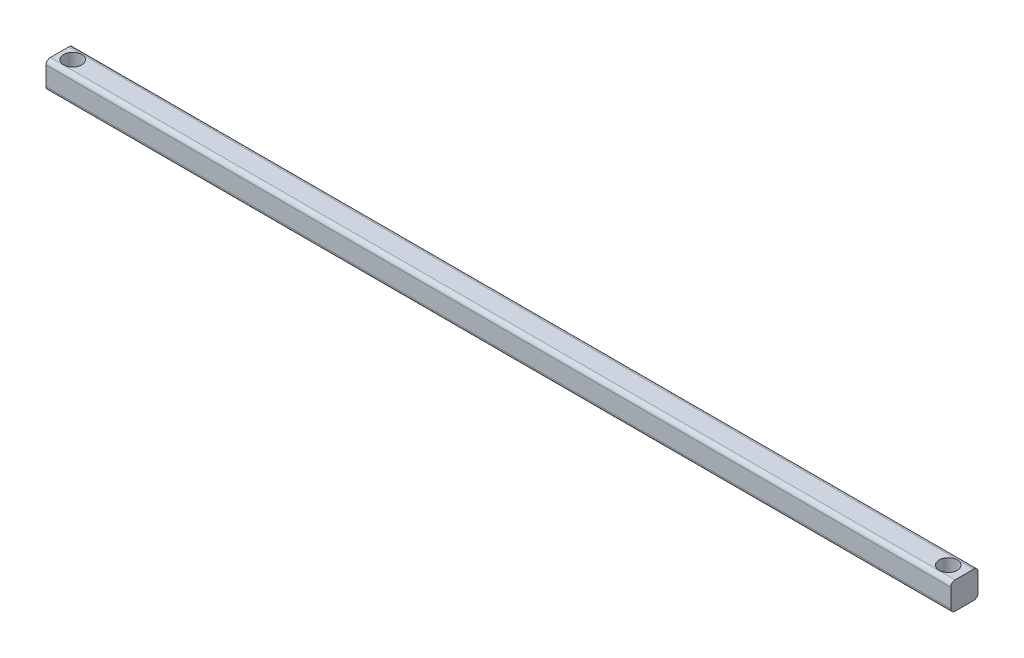
ISO-10303-21;
HEADER;
FILE_DESCRIPTION(('STEP AP214'),'2;1');
FILE_NAME('part.step','',(''),(''),'','','');
FILE_SCHEMA(('AUTOMOTIVE_DESIGN { 1 0 10303 214 1 1 1 1 }'));
ENDSEC;
DATA;
#1=APPLICATION_CONTEXT('core data for automotive mechanical design processes');
#2=APPLICATION_PROTOCOL_DEFINITION('international standard','automotive_design',2000,#1);
#3=PRODUCT_CONTEXT('',#1,'mechanical');
#4=PRODUCT('Part','Part','',(#3));
#5=PRODUCT_RELATED_PRODUCT_CATEGORY('part','',(#4));
#6=PRODUCT_DEFINITION_FORMATION('','',#4);
#7=PRODUCT_DEFINITION_CONTEXT('part definition',#1,'design');
#8=PRODUCT_DEFINITION('design','',#6,#7);
#9=PRODUCT_DEFINITION_SHAPE('','',#8);
#10=(LENGTH_UNIT() NAMED_UNIT(*) SI_UNIT(.MILLI.,.METRE.));
#11=(NAMED_UNIT(*) PLANE_ANGLE_UNIT() SI_UNIT($,.RADIAN.));
#12=(NAMED_UNIT(*) SI_UNIT($,.STERADIAN.) SOLID_ANGLE_UNIT());
#13=UNCERTAINTY_MEASURE_WITH_UNIT(LENGTH_MEASURE(1.E-05),#10,'distance_accuracy_value','');
#14=(GEOMETRIC_REPRESENTATION_CONTEXT(3) GLOBAL_UNCERTAINTY_ASSIGNED_CONTEXT((#13)) GLOBAL_UNIT_ASSIGNED_CONTEXT((#10,
#11,#12)) REPRESENTATION_CONTEXT('',''));
#15=CARTESIAN_POINT('',(0.,0.,0.));
#16=DIRECTION('',(0.,0.,1.));
#17=DIRECTION('',(1.,0.,0.));
#18=AXIS2_PLACEMENT_3D('',#15,#16,#17);
#19=CARTESIAN_POINT('',(210.,-3.16,-3.16));
#20=DIRECTION('',(0.,0.,1.));
#21=DIRECTION('',(1.,0.,0.));
#22=AXIS2_PLACEMENT_3D('',#19,#20,#21);
#23=PLANE('',#22);
#24=DIRECTION('',(0.,1.,0.));
#25=VECTOR('',#24,1.);
#26=CARTESIAN_POINT('',(210.,-3.16,-3.16));
#27=LINE('',#26,#25);
#28=CARTESIAN_POINT('',(210.,-2.16,-3.16));
#29=VERTEX_POINT('',#28);
#30=CARTESIAN_POINT('',(210.,2.16,-3.16));
#31=VERTEX_POINT('',#30);
#32=EDGE_CURVE('E121',#29,#31,#27,.T.);
#33=ORIENTED_EDGE('',*,*,#32,.F.);
#34=DIRECTION('',(-1.,0.,0.));
#35=VECTOR('',#34,1.);
#36=CARTESIAN_POINT('',(210.,-2.16,-3.16));
#37=LINE('',#36,#35);
#38=CARTESIAN_POINT('',(0.,-2.16,-3.16));
#39=VERTEX_POINT('',#38);
#40=EDGE_CURVE('E106',#29,#39,#37,.T.);
#41=ORIENTED_EDGE('',*,*,#40,.T.);
#42=DIRECTION('',(0.,1.,0.));
#43=VECTOR('',#42,1.);
#44=CARTESIAN_POINT('',(0.,-3.16,-3.16));
#45=LINE('',#44,#43);
#46=CARTESIAN_POINT('',(0.,2.16,-3.16));
#47=VERTEX_POINT('',#46);
#48=EDGE_CURVE('E118',#39,#47,#45,.T.);
#49=ORIENTED_EDGE('',*,*,#48,.T.);
#50=DIRECTION('',(-1.,0.,0.));
#51=VECTOR('',#50,1.);
#52=CARTESIAN_POINT('',(210.,2.16,-3.16));
#53=LINE('',#52,#51);
#54=EDGE_CURVE('E123',#47,#31,#53,.F.);
#55=ORIENTED_EDGE('',*,*,#54,.T.);
#56=EDGE_LOOP('',(#33,#41,#49,#55));
#57=FACE_BOUND('',#56,.T.);
#58=ADVANCED_FACE('F35',(#57),#23,.F.);
#59=CARTESIAN_POINT('',(210.,3.16,3.16));
#60=DIRECTION('',(0.,-1.,0.));
#61=DIRECTION('',(0.,0.,-1.));
#62=AXIS2_PLACEMENT_3D('',#59,#60,#61);
#63=PLANE('',#62);
#64=CARTESIAN_POINT('',(3.04334172329617,3.16,0.));
#65=DIRECTION('',(0.,1.,0.));
#66=DIRECTION('',(0.,0.,1.));
#67=AXIS2_PLACEMENT_3D('',#64,#65,#66);
#68=CIRCLE('',#67,2.1);
#69=CARTESIAN_POINT('',(3.04334172329617,3.16,2.1));
#70=VERTEX_POINT('',#69);
#71=EDGE_CURVE('E145',#70,#70,#68,.T.);
#72=ORIENTED_EDGE('',*,*,#71,.F.);
#73=EDGE_LOOP('',(#72));
#74=FACE_BOUND('',#73,.T.);
#75=CARTESIAN_POINT('',(206.243341723296,3.16,0.));
#76=DIRECTION('',(0.,1.,0.));
#77=DIRECTION('',(0.,0.,1.));
#78=AXIS2_PLACEMENT_3D('',#75,#76,#77);
#79=CIRCLE('',#78,2.09999999999999);
#80=CARTESIAN_POINT('',(206.243341723296,3.16,2.09999999999999));
#81=VERTEX_POINT('',#80);
#82=EDGE_CURVE('E188',#81,#81,#79,.T.);
#83=ORIENTED_EDGE('',*,*,#82,.F.);
#84=EDGE_LOOP('',(#83));
#85=FACE_BOUND('',#84,.T.);
#86=DIRECTION('',(0.,0.,1.));
#87=VECTOR('',#86,1.);
#88=CARTESIAN_POINT('',(210.,3.16,3.16));
#89=LINE('',#88,#87);
#90=CARTESIAN_POINT('',(210.,3.16,-2.16));
#91=VERTEX_POINT('',#90);
#92=CARTESIAN_POINT('',(210.,3.16,2.16));
#93=VERTEX_POINT('',#92);
#94=EDGE_CURVE('E168',#91,#93,#89,.T.);
#95=ORIENTED_EDGE('',*,*,#94,.F.);
#96=DIRECTION('',(-1.,0.,0.));
#97=VECTOR('',#96,1.);
#98=CARTESIAN_POINT('',(210.,3.16,-2.16));
#99=LINE('',#98,#97);
#100=CARTESIAN_POINT('',(0.,3.16,-2.16));
#101=VERTEX_POINT('',#100);
#102=EDGE_CURVE('E11',#91,#101,#99,.T.);
#103=ORIENTED_EDGE('',*,*,#102,.T.);
#104=DIRECTION('',(0.,0.,1.));
#105=VECTOR('',#104,1.);
#106=CARTESIAN_POINT('',(0.,3.16,3.16));
#107=LINE('',#106,#105);
#108=CARTESIAN_POINT('',(0.,3.16,2.16));
#109=VERTEX_POINT('',#108);
#110=EDGE_CURVE('E128',#101,#109,#107,.T.);
#111=ORIENTED_EDGE('',*,*,#110,.T.);
#112=DIRECTION('',(-1.,0.,0.));
#113=VECTOR('',#112,1.);
#114=CARTESIAN_POINT('',(210.,3.16,2.16));
#115=LINE('',#114,#113);
#116=EDGE_CURVE('E43',#109,#93,#115,.F.);
#117=ORIENTED_EDGE('',*,*,#116,.T.);
#118=EDGE_LOOP('',(#95,#103,#111,#117));
#119=FACE_BOUND('',#118,.T.);
#120=ADVANCED_FACE('F167',(#74,#85,#119),#63,.F.);
#121=CARTESIAN_POINT('',(210.,-3.16,3.16));
#122=DIRECTION('',(0.,0.,-1.));
#123=DIRECTION('',(-1.,0.,0.));
#124=AXIS2_PLACEMENT_3D('',#121,#122,#123);
#125=PLANE('',#124);
#126=DIRECTION('',(0.,-1.,0.));
#127=VECTOR('',#126,1.);
#128=CARTESIAN_POINT('',(0.,-3.16,3.16));
#129=LINE('',#128,#127);
#130=CARTESIAN_POINT('',(0.,2.16,3.16));
#131=VERTEX_POINT('',#130);
#132=CARTESIAN_POINT('',(0.,-2.16,3.16));
#133=VERTEX_POINT('',#132);
#134=EDGE_CURVE('E132',#131,#133,#129,.T.);
#135=ORIENTED_EDGE('',*,*,#134,.T.);
#136=DIRECTION('',(-1.,0.,0.));
#137=VECTOR('',#136,1.);
#138=CARTESIAN_POINT('',(210.,-2.16,3.16));
#139=LINE('',#138,#137);
#140=CARTESIAN_POINT('',(210.,-2.16,3.16));
#141=VERTEX_POINT('',#140);
#142=EDGE_CURVE('E50',#133,#141,#139,.F.);
#143=ORIENTED_EDGE('',*,*,#142,.T.);
#144=DIRECTION('',(0.,-1.,0.));
#145=VECTOR('',#144,1.);
#146=CARTESIAN_POINT('',(210.,-3.16,3.16));
#147=LINE('',#146,#145);
#148=CARTESIAN_POINT('',(210.,2.16,3.16));
#149=VERTEX_POINT('',#148);
#150=EDGE_CURVE('E174',#149,#141,#147,.T.);
#151=ORIENTED_EDGE('',*,*,#150,.F.);
#152=DIRECTION('',(-1.,0.,0.));
#153=VECTOR('',#152,1.);
#154=CARTESIAN_POINT('',(210.,2.16,3.16));
#155=LINE('',#154,#153);
#156=EDGE_CURVE('E161',#149,#131,#155,.T.);
#157=ORIENTED_EDGE('',*,*,#156,.T.);
#158=EDGE_LOOP('',(#135,#143,#151,#157));
#159=FACE_BOUND('',#158,.T.);
#160=ADVANCED_FACE('F178',(#159),#125,.F.);
#161=CARTESIAN_POINT('',(210.,-3.16,3.16));
#162=DIRECTION('',(0.,1.,0.));
#163=DIRECTION('',(0.,0.,1.));
#164=AXIS2_PLACEMENT_3D('',#161,#162,#163);
#165=PLANE('',#164);
#166=CARTESIAN_POINT('',(3.04334172329617,-3.16,0.));
#167=DIRECTION('',(0.,1.,0.));
#168=DIRECTION('',(0.,0.,1.));
#169=AXIS2_PLACEMENT_3D('',#166,#167,#168);
#170=CIRCLE('',#169,2.1);
#171=CARTESIAN_POINT('',(3.04334172329617,-3.16,2.1));
#172=VERTEX_POINT('',#171);
#173=EDGE_CURVE('E129',#172,#172,#170,.T.);
#174=ORIENTED_EDGE('',*,*,#173,.T.);
#175=EDGE_LOOP('',(#174));
#176=FACE_BOUND('',#175,.T.);
#177=CARTESIAN_POINT('',(206.243341723296,-3.16,0.));
#178=DIRECTION('',(0.,1.,0.));
#179=DIRECTION('',(0.,0.,1.));
#180=AXIS2_PLACEMENT_3D('',#177,#178,#179);
#181=CIRCLE('',#180,2.09999999999999);
#182=CARTESIAN_POINT('',(206.243341723296,-3.16,2.09999999999999));
#183=VERTEX_POINT('',#182);
#184=EDGE_CURVE('E135',#183,#183,#181,.T.);
#185=ORIENTED_EDGE('',*,*,#184,.T.);
#186=EDGE_LOOP('',(#185));
#187=FACE_BOUND('',#186,.T.);
#188=DIRECTION('',(0.,0.,-1.));
#189=VECTOR('',#188,1.);
#190=CARTESIAN_POINT('',(0.,-3.16,3.16));
#191=LINE('',#190,#189);
#192=CARTESIAN_POINT('',(0.,-3.16,2.16));
#193=VERTEX_POINT('',#192);
#194=CARTESIAN_POINT('',(0.,-3.16,-2.16));
#195=VERTEX_POINT('',#194);
#196=EDGE_CURVE('E142',#193,#195,#191,.T.);
#197=ORIENTED_EDGE('',*,*,#196,.T.);
#198=DIRECTION('',(-1.,0.,0.));
#199=VECTOR('',#198,1.);
#200=CARTESIAN_POINT('',(210.,-3.16,-2.16));
#201=LINE('',#200,#199);
#202=CARTESIAN_POINT('',(210.,-3.16,-2.16));
#203=VERTEX_POINT('',#202);
#204=EDGE_CURVE('E107',#195,#203,#201,.F.);
#205=ORIENTED_EDGE('',*,*,#204,.T.);
#206=DIRECTION('',(0.,0.,-1.));
#207=VECTOR('',#206,1.);
#208=CARTESIAN_POINT('',(210.,-3.16,3.16));
#209=LINE('',#208,#207);
#210=CARTESIAN_POINT('',(210.,-3.16,2.16));
#211=VERTEX_POINT('',#210);
#212=EDGE_CURVE('E138',#211,#203,#209,.T.);
#213=ORIENTED_EDGE('',*,*,#212,.F.);
#214=DIRECTION('',(-1.,0.,0.));
#215=VECTOR('',#214,1.);
#216=CARTESIAN_POINT('',(210.,-3.16,2.16));
#217=LINE('',#216,#215);
#218=EDGE_CURVE('E112',#211,#193,#217,.T.);
#219=ORIENTED_EDGE('',*,*,#218,.T.);
#220=EDGE_LOOP('',(#197,#205,#213,#219));
#221=FACE_BOUND('',#220,.T.);
#222=ADVANCED_FACE('F185',(#176,#187,#221),#165,.F.);
#223=CARTESIAN_POINT('',(210.,0.,0.));
#224=DIRECTION('',(-1.,0.,0.));
#225=DIRECTION('',(0.,0.,1.));
#226=AXIS2_PLACEMENT_3D('',#223,#224,#225);
#227=PLANE('',#226);
#228=ORIENTED_EDGE('',*,*,#212,.T.);
#229=CARTESIAN_POINT('',(210.,-2.16,-2.16));
#230=DIRECTION('',(-1.,0.,0.));
#231=DIRECTION('',(0.,0.,1.));
#232=AXIS2_PLACEMENT_3D('',#229,#230,#231);
#233=CIRCLE('',#232,1.);
#234=EDGE_CURVE('E159',#203,#29,#233,.F.);
#235=ORIENTED_EDGE('',*,*,#234,.T.);
#236=ORIENTED_EDGE('',*,*,#32,.T.);
#237=CARTESIAN_POINT('',(210.,2.16,-2.16));
#238=DIRECTION('',(-1.,0.,0.));
#239=DIRECTION('',(0.,0.,1.));
#240=AXIS2_PLACEMENT_3D('',#237,#238,#239);
#241=CIRCLE('',#240,1.);
#242=EDGE_CURVE('E155',#31,#91,#241,.F.);
#243=ORIENTED_EDGE('',*,*,#242,.T.);
#244=ORIENTED_EDGE('',*,*,#94,.T.);
#245=CARTESIAN_POINT('',(210.,2.16,2.16));
#246=DIRECTION('',(-1.,0.,0.));
#247=DIRECTION('',(0.,0.,1.));
#248=AXIS2_PLACEMENT_3D('',#245,#246,#247);
#249=CIRCLE('',#248,1.);
#250=EDGE_CURVE('E57',#93,#149,#249,.F.);
#251=ORIENTED_EDGE('',*,*,#250,.T.);
#252=ORIENTED_EDGE('',*,*,#150,.T.);
#253=CARTESIAN_POINT('',(210.,-2.16,2.16));
#254=DIRECTION('',(-1.,0.,0.));
#255=DIRECTION('',(0.,0.,1.));
#256=AXIS2_PLACEMENT_3D('',#253,#254,#255);
#257=CIRCLE('',#256,1.);
#258=EDGE_CURVE('E157',#141,#211,#257,.F.);
#259=ORIENTED_EDGE('',*,*,#258,.T.);
#260=EDGE_LOOP('',(#228,#235,#236,#243,#244,#251,#252,#259));
#261=FACE_BOUND('',#260,.T.);
#262=ADVANCED_FACE('F172',(#261),#227,.F.);
#263=CARTESIAN_POINT('',(0.,0.,0.));
#264=DIRECTION('',(-1.,0.,0.));
#265=DIRECTION('',(0.,0.,1.));
#266=AXIS2_PLACEMENT_3D('',#263,#264,#265);
#267=PLANE('',#266);
#268=ORIENTED_EDGE('',*,*,#48,.F.);
#269=CARTESIAN_POINT('',(0.,-2.16,-2.16));
#270=DIRECTION('',(-1.,0.,0.));
#271=DIRECTION('',(0.,0.,1.));
#272=AXIS2_PLACEMENT_3D('',#269,#270,#271);
#273=CIRCLE('',#272,1.);
#274=EDGE_CURVE('E102',#39,#195,#273,.T.);
#275=ORIENTED_EDGE('',*,*,#274,.T.);
#276=ORIENTED_EDGE('',*,*,#196,.F.);
#277=CARTESIAN_POINT('',(0.,-2.16,2.16));
#278=DIRECTION('',(-1.,0.,0.));
#279=DIRECTION('',(0.,0.,1.));
#280=AXIS2_PLACEMENT_3D('',#277,#278,#279);
#281=CIRCLE('',#280,1.);
#282=EDGE_CURVE('E113',#193,#133,#281,.T.);
#283=ORIENTED_EDGE('',*,*,#282,.T.);
#284=ORIENTED_EDGE('',*,*,#134,.F.);
#285=CARTESIAN_POINT('',(0.,2.16,2.16));
#286=DIRECTION('',(-1.,0.,0.));
#287=DIRECTION('',(0.,0.,1.));
#288=AXIS2_PLACEMENT_3D('',#285,#286,#287);
#289=CIRCLE('',#288,1.);
#290=EDGE_CURVE('E122',#131,#109,#289,.T.);
#291=ORIENTED_EDGE('',*,*,#290,.T.);
#292=ORIENTED_EDGE('',*,*,#110,.F.);
#293=CARTESIAN_POINT('',(0.,2.16,-2.16));
#294=DIRECTION('',(-1.,0.,0.));
#295=DIRECTION('',(0.,0.,1.));
#296=AXIS2_PLACEMENT_3D('',#293,#294,#295);
#297=CIRCLE('',#296,1.);
#298=EDGE_CURVE('E127',#101,#47,#297,.T.);
#299=ORIENTED_EDGE('',*,*,#298,.T.);
#300=EDGE_LOOP('',(#268,#275,#276,#283,#284,#291,#292,#299));
#301=FACE_BOUND('',#300,.T.);
#302=ADVANCED_FACE('F125',(#301),#267,.T.);
#303=CARTESIAN_POINT('',(206.243341723296,-206.84,0.));
#304=DIRECTION('',(0.,1.,0.));
#305=DIRECTION('',(0.,0.,1.));
#306=AXIS2_PLACEMENT_3D('',#303,#304,#305);
#307=CYLINDRICAL_SURFACE('',#306,2.09999999999999);
#308=ORIENTED_EDGE('',*,*,#82,.T.);
#309=EDGE_LOOP('',(#308));
#310=FACE_BOUND('',#309,.T.);
#311=ORIENTED_EDGE('',*,*,#184,.F.);
#312=EDGE_LOOP('',(#311));
#313=FACE_BOUND('',#312,.T.);
#314=ADVANCED_FACE('F202',(#310,#313),#307,.F.);
#315=CARTESIAN_POINT('',(3.04334172329617,-206.84,0.));
#316=DIRECTION('',(0.,1.,0.));
#317=DIRECTION('',(0.,0.,1.));
#318=AXIS2_PLACEMENT_3D('',#315,#316,#317);
#319=CYLINDRICAL_SURFACE('',#318,2.1);
#320=ORIENTED_EDGE('',*,*,#71,.T.);
#321=EDGE_LOOP('',(#320));
#322=FACE_BOUND('',#321,.T.);
#323=ORIENTED_EDGE('',*,*,#173,.F.);
#324=EDGE_LOOP('',(#323));
#325=FACE_BOUND('',#324,.T.);
#326=ADVANCED_FACE('F194',(#322,#325),#319,.F.);
#327=CARTESIAN_POINT('',(210.,-2.16,-2.16));
#328=DIRECTION('',(-1.,0.,0.));
#329=DIRECTION('',(0.,0.,1.));
#330=AXIS2_PLACEMENT_3D('',#327,#328,#329);
#331=CYLINDRICAL_SURFACE('',#330,1.);
#332=ORIENTED_EDGE('',*,*,#234,.F.);
#333=ORIENTED_EDGE('',*,*,#204,.F.);
#334=ORIENTED_EDGE('',*,*,#274,.F.);
#335=ORIENTED_EDGE('',*,*,#40,.F.);
#336=EDGE_LOOP('',(#332,#333,#334,#335));
#337=FACE_BOUND('',#336,.T.);
#338=ADVANCED_FACE('F105',(#337),#331,.T.);
#339=CARTESIAN_POINT('',(210.,-2.16,2.16));
#340=DIRECTION('',(-1.,0.,0.));
#341=DIRECTION('',(0.,0.,1.));
#342=AXIS2_PLACEMENT_3D('',#339,#340,#341);
#343=CYLINDRICAL_SURFACE('',#342,1.);
#344=ORIENTED_EDGE('',*,*,#258,.F.);
#345=ORIENTED_EDGE('',*,*,#142,.F.);
#346=ORIENTED_EDGE('',*,*,#282,.F.);
#347=ORIENTED_EDGE('',*,*,#218,.F.);
#348=EDGE_LOOP('',(#344,#345,#346,#347));
#349=FACE_BOUND('',#348,.T.);
#350=ADVANCED_FACE('F182',(#349),#343,.T.);
#351=CARTESIAN_POINT('',(210.,2.16,-2.16));
#352=DIRECTION('',(-1.,0.,0.));
#353=DIRECTION('',(0.,0.,1.));
#354=AXIS2_PLACEMENT_3D('',#351,#352,#353);
#355=CYLINDRICAL_SURFACE('',#354,1.);
#356=ORIENTED_EDGE('',*,*,#242,.F.);
#357=ORIENTED_EDGE('',*,*,#54,.F.);
#358=ORIENTED_EDGE('',*,*,#298,.F.);
#359=ORIENTED_EDGE('',*,*,#102,.F.);
#360=EDGE_LOOP('',(#356,#357,#358,#359));
#361=FACE_BOUND('',#360,.T.);
#362=ADVANCED_FACE('F226',(#361),#355,.T.);
#363=CARTESIAN_POINT('',(210.,2.16,2.16));
#364=DIRECTION('',(-1.,0.,0.));
#365=DIRECTION('',(0.,0.,1.));
#366=AXIS2_PLACEMENT_3D('',#363,#364,#365);
#367=CYLINDRICAL_SURFACE('',#366,1.);
#368=ORIENTED_EDGE('',*,*,#250,.F.);
#369=ORIENTED_EDGE('',*,*,#116,.F.);
#370=ORIENTED_EDGE('',*,*,#290,.F.);
#371=ORIENTED_EDGE('',*,*,#156,.F.);
#372=EDGE_LOOP('',(#368,#369,#370,#371));
#373=FACE_BOUND('',#372,.T.);
#374=ADVANCED_FACE('F37',(#373),#367,.T.);
#375=CLOSED_SHELL('',(#58,#120,#160,#222,#262,#302,#314,#326,#338,#350,#362,#374));
#376=MANIFOLD_SOLID_BREP('B2',#375);
#377=ADVANCED_BREP_SHAPE_REPRESENTATION('',(#18,#376),#14);
#378=SHAPE_DEFINITION_REPRESENTATION(#9,#377);
ENDSEC;
END-ISO-10303-21;
